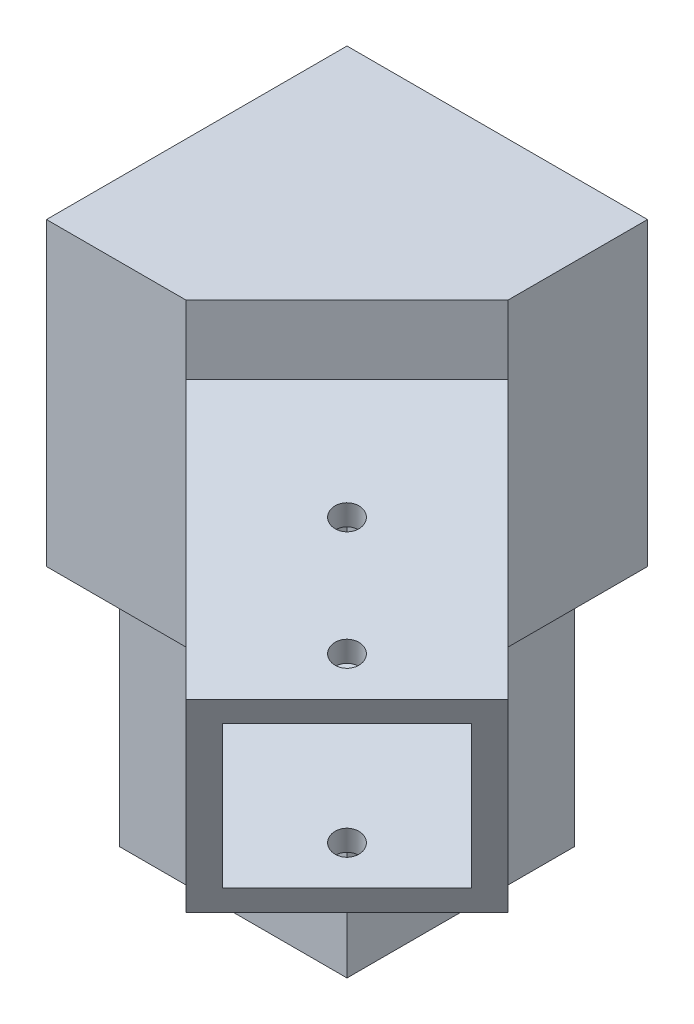
ISO-10303-21;
HEADER;
FILE_DESCRIPTION(('STEP AP214'),'2;1');
FILE_NAME('part.step','',(''),(''),'','','');
FILE_SCHEMA(('AUTOMOTIVE_DESIGN { 1 0 10303 214 1 1 1 1 }'));
ENDSEC;
DATA;
#1=APPLICATION_CONTEXT('core data for automotive mechanical design processes');
#2=APPLICATION_PROTOCOL_DEFINITION('international standard','automotive_design',2000,#1);
#3=PRODUCT_CONTEXT('',#1,'mechanical');
#4=PRODUCT('Part','Part','',(#3));
#5=PRODUCT_RELATED_PRODUCT_CATEGORY('part','',(#4));
#6=PRODUCT_DEFINITION_FORMATION('','',#4);
#7=PRODUCT_DEFINITION_CONTEXT('part definition',#1,'design');
#8=PRODUCT_DEFINITION('design','',#6,#7);
#9=PRODUCT_DEFINITION_SHAPE('','',#8);
#10=(LENGTH_UNIT() NAMED_UNIT(*) SI_UNIT(.MILLI.,.METRE.));
#11=(NAMED_UNIT(*) PLANE_ANGLE_UNIT() SI_UNIT($,.RADIAN.));
#12=(NAMED_UNIT(*) SI_UNIT($,.STERADIAN.) SOLID_ANGLE_UNIT());
#13=UNCERTAINTY_MEASURE_WITH_UNIT(LENGTH_MEASURE(1.E-05),#10,'distance_accuracy_value','');
#14=(GEOMETRIC_REPRESENTATION_CONTEXT(3) GLOBAL_UNCERTAINTY_ASSIGNED_CONTEXT((#13)) GLOBAL_UNIT_ASSIGNED_CONTEXT((#10,
#11,#12)) REPRESENTATION_CONTEXT('',''));
#15=CARTESIAN_POINT('',(0.,0.,0.));
#16=DIRECTION('',(0.,0.,1.));
#17=DIRECTION('',(1.,0.,0.));
#18=AXIS2_PLACEMENT_3D('',#15,#16,#17);
#19=CARTESIAN_POINT('',(-10.25,-50.,10.25));
#20=DIRECTION('',(0.,0.,1.));
#21=DIRECTION('',(1.,0.,0.));
#22=AXIS2_PLACEMENT_3D('',#19,#20,#21);
#23=PLANE('',#22);
#24=DIRECTION('',(0.,1.,0.));
#25=VECTOR('',#24,1.);
#26=CARTESIAN_POINT('',(-4.2456890143242,-50.,10.25));
#27=LINE('',#26,#25);
#28=CARTESIAN_POINT('',(-4.24568901432425,-11.5315924193513,10.25));
#29=VERTEX_POINT('',#28);
#30=CARTESIAN_POINT('',(-4.24568901432422,0.,10.25));
#31=VERTEX_POINT('',#30);
#32=EDGE_CURVE('E224',#29,#31,#27,.T.);
#33=ORIENTED_EDGE('',*,*,#32,.F.);
#34=DIRECTION('',(-0.986393923832144,0.164398987305357,0.));
#35=VECTOR('',#34,1.);
#36=CARTESIAN_POINT('',(-3.84960117649816,-11.597607058989,10.25));
#37=LINE('',#36,#35);
#38=CARTESIAN_POINT('',(10.25,-13.9475405884053,10.25));
#39=VERTEX_POINT('',#38);
#40=EDGE_CURVE('E232',#39,#29,#37,.T.);
#41=ORIENTED_EDGE('',*,*,#40,.F.);
#42=DIRECTION('',(0.,1.,0.));
#43=VECTOR('',#42,1.);
#44=CARTESIAN_POINT('',(10.25,-50.,10.25));
#45=LINE('',#44,#43);
#46=CARTESIAN_POINT('',(10.25,-50.,10.25));
#47=VERTEX_POINT('',#46);
#48=EDGE_CURVE('E345',#47,#39,#45,.T.);
#49=ORIENTED_EDGE('',*,*,#48,.F.);
#50=DIRECTION('',(1.,0.,0.));
#51=VECTOR('',#50,1.);
#52=CARTESIAN_POINT('',(-10.25,-50.,10.25));
#53=LINE('',#52,#51);
#54=CARTESIAN_POINT('',(-10.25,-50.,10.25));
#55=VERTEX_POINT('',#54);
#56=EDGE_CURVE('E341',#55,#47,#53,.T.);
#57=ORIENTED_EDGE('',*,*,#56,.F.);
#58=DIRECTION('',(0.,1.,0.));
#59=VECTOR('',#58,1.);
#60=CARTESIAN_POINT('',(-10.25,-50.,10.25));
#61=LINE('',#60,#59);
#62=CARTESIAN_POINT('',(-10.25,0.,10.25));
#63=VERTEX_POINT('',#62);
#64=EDGE_CURVE('E349',#55,#63,#61,.T.);
#65=ORIENTED_EDGE('',*,*,#64,.T.);
#66=DIRECTION('',(1.,0.,0.));
#67=VECTOR('',#66,1.);
#68=CARTESIAN_POINT('',(0.,0.,10.25));
#69=LINE('',#68,#67);
#70=EDGE_CURVE('E246',#63,#31,#69,.T.);
#71=ORIENTED_EDGE('',*,*,#70,.T.);
#72=EDGE_LOOP('',(#33,#41,#49,#57,#65,#71));
#73=FACE_BOUND('',#72,.T.);
#74=ADVANCED_FACE('F43',(#73),#23,.F.);
#75=CARTESIAN_POINT('',(13.25,-50.,-13.25));
#76=DIRECTION('',(1.,0.,0.));
#77=DIRECTION('',(0.,0.,-1.));
#78=AXIS2_PLACEMENT_3D('',#75,#76,#77);
#79=PLANE('',#78);
#80=CARTESIAN_POINT('',(13.25,-42.5,0.));
#81=DIRECTION('',(1.,0.,0.));
#82=DIRECTION('',(0.,0.,-1.));
#83=AXIS2_PLACEMENT_3D('',#80,#81,#82);
#84=CIRCLE('',#83,1.6);
#85=CARTESIAN_POINT('',(13.25,-42.5,-1.6));
#86=VERTEX_POINT('',#85);
#87=EDGE_CURVE('E560',#86,#86,#84,.T.);
#88=ORIENTED_EDGE('',*,*,#87,.F.);
#89=EDGE_LOOP('',(#88));
#90=FACE_BOUND('',#89,.T.);
#91=CARTESIAN_POINT('',(13.25,-22.5,0.));
#92=DIRECTION('',(1.,0.,0.));
#93=DIRECTION('',(0.,0.,-1.));
#94=AXIS2_PLACEMENT_3D('',#91,#92,#93);
#95=CIRCLE('',#94,1.6);
#96=CARTESIAN_POINT('',(13.25,-22.5,-1.6));
#97=VERTEX_POINT('',#96);
#98=EDGE_CURVE('E557',#97,#97,#95,.T.);
#99=ORIENTED_EDGE('',*,*,#98,.F.);
#100=EDGE_LOOP('',(#99));
#101=FACE_BOUND('',#100,.T.);
#102=DIRECTION('',(0.,1.,0.));
#103=VECTOR('',#102,1.);
#104=CARTESIAN_POINT('',(13.25,-50.,-13.25));
#105=LINE('',#104,#103);
#106=CARTESIAN_POINT('',(13.25,-50.,-13.25));
#107=VERTEX_POINT('',#106);
#108=CARTESIAN_POINT('',(13.25,-17.5,-13.25));
#109=VERTEX_POINT('',#108);
#110=EDGE_CURVE('E365',#107,#109,#105,.T.);
#111=ORIENTED_EDGE('',*,*,#110,.T.);
#112=DIRECTION('',(0.,0.,1.));
#113=VECTOR('',#112,1.);
#114=CARTESIAN_POINT('',(13.25,-17.5,-13.25));
#115=LINE('',#114,#113);
#116=CARTESIAN_POINT('',(13.25,-17.5,10.0715144606611));
#117=VERTEX_POINT('',#116);
#118=EDGE_CURVE('E294',#109,#117,#115,.T.);
#119=ORIENTED_EDGE('',*,*,#118,.T.);
#120=DIRECTION('',(0.,-0.164398987305357,0.986393923832144));
#121=VECTOR('',#120,1.);
#122=CARTESIAN_POINT('',(13.25,-14.5965111685415,-7.34941852809024));
#123=LINE('',#122,#121);
#124=CARTESIAN_POINT('',(13.25,-18.0297475898898,13.25));
#125=VERTEX_POINT('',#124);
#126=EDGE_CURVE('E330',#117,#125,#123,.T.);
#127=ORIENTED_EDGE('',*,*,#126,.T.);
#128=DIRECTION('',(0.,1.,0.));
#129=VECTOR('',#128,1.);
#130=CARTESIAN_POINT('',(13.25,-50.,13.25));
#131=LINE('',#130,#129);
#132=CARTESIAN_POINT('',(13.25,-50.,13.25));
#133=VERTEX_POINT('',#132);
#134=EDGE_CURVE('E366',#133,#125,#131,.T.);
#135=ORIENTED_EDGE('',*,*,#134,.F.);
#136=DIRECTION('',(0.,0.,-1.));
#137=VECTOR('',#136,1.);
#138=CARTESIAN_POINT('',(13.25,-50.,-13.25));
#139=LINE('',#138,#137);
#140=EDGE_CURVE('E348',#133,#107,#139,.T.);
#141=ORIENTED_EDGE('',*,*,#140,.T.);
#142=EDGE_LOOP('',(#111,#119,#127,#135,#141));
#143=FACE_BOUND('',#142,.T.);
#144=ADVANCED_FACE('F45',(#90,#101,#143),#79,.T.);
#145=CARTESIAN_POINT('',(-13.25,-50.,13.25));
#146=DIRECTION('',(0.,0.,1.));
#147=DIRECTION('',(1.,0.,0.));
#148=AXIS2_PLACEMENT_3D('',#145,#146,#147);
#149=PLANE('',#148);
#150=DIRECTION('',(-0.986393923832144,0.164398987305357,0.));
#151=VECTOR('',#150,1.);
#152=CARTESIAN_POINT('',(-7.34941852809024,-14.5965111685414,13.25));
#153=LINE('',#152,#151);
#154=CARTESIAN_POINT('',(10.0715144606611,-17.5,13.25));
#155=VERTEX_POINT('',#154);
#156=EDGE_CURVE('E328',#125,#155,#153,.T.);
#157=ORIENTED_EDGE('',*,*,#156,.T.);
#158=DIRECTION('',(-1.,0.,0.));
#159=VECTOR('',#158,1.);
#160=CARTESIAN_POINT('',(-13.25,-17.5,13.25));
#161=LINE('',#160,#159);
#162=CARTESIAN_POINT('',(-13.25,-17.5,13.25));
#163=VERTEX_POINT('',#162);
#164=EDGE_CURVE('E68',#155,#163,#161,.T.);
#165=ORIENTED_EDGE('',*,*,#164,.T.);
#166=DIRECTION('',(0.,1.,0.));
#167=VECTOR('',#166,1.);
#168=CARTESIAN_POINT('',(-13.25,-50.,13.25));
#169=LINE('',#168,#167);
#170=CARTESIAN_POINT('',(-13.25,-50.,13.25));
#171=VERTEX_POINT('',#170);
#172=EDGE_CURVE('E370',#171,#163,#169,.T.);
#173=ORIENTED_EDGE('',*,*,#172,.F.);
#174=DIRECTION('',(1.,0.,0.));
#175=VECTOR('',#174,1.);
#176=CARTESIAN_POINT('',(-13.25,-50.,13.25));
#177=LINE('',#176,#175);
#178=EDGE_CURVE('E362',#171,#133,#177,.T.);
#179=ORIENTED_EDGE('',*,*,#178,.T.);
#180=ORIENTED_EDGE('',*,*,#134,.T.);
#181=EDGE_LOOP('',(#157,#165,#173,#179,#180));
#182=FACE_BOUND('',#181,.T.);
#183=ADVANCED_FACE('F463',(#182),#149,.T.);
#184=CARTESIAN_POINT('',(10.25,-50.,-10.25));
#185=DIRECTION('',(1.,0.,0.));
#186=DIRECTION('',(0.,0.,-1.));
#187=AXIS2_PLACEMENT_3D('',#184,#185,#186);
#188=PLANE('',#187);
#189=CARTESIAN_POINT('',(10.25,-42.5,0.));
#190=DIRECTION('',(1.,0.,0.));
#191=DIRECTION('',(0.,0.,-1.));
#192=AXIS2_PLACEMENT_3D('',#189,#190,#191);
#193=CIRCLE('',#192,1.6);
#194=CARTESIAN_POINT('',(10.25,-42.5,-1.6));
#195=VERTEX_POINT('',#194);
#196=EDGE_CURVE('E400',#195,#195,#193,.T.);
#197=ORIENTED_EDGE('',*,*,#196,.T.);
#198=EDGE_LOOP('',(#197));
#199=FACE_BOUND('',#198,.T.);
#200=CARTESIAN_POINT('',(10.25,-22.5,0.));
#201=DIRECTION('',(1.,0.,0.));
#202=DIRECTION('',(0.,0.,-1.));
#203=AXIS2_PLACEMENT_3D('',#200,#201,#202);
#204=CIRCLE('',#203,1.6);
#205=CARTESIAN_POINT('',(10.25,-22.5,-1.6));
#206=VERTEX_POINT('',#205);
#207=EDGE_CURVE('E545',#206,#206,#204,.T.);
#208=ORIENTED_EDGE('',*,*,#207,.T.);
#209=EDGE_LOOP('',(#208));
#210=FACE_BOUND('',#209,.T.);
#211=DIRECTION('',(0.,-0.164398987305357,0.986393923832144));
#212=VECTOR('',#211,1.);
#213=CARTESIAN_POINT('',(10.25,-11.597607058989,-3.84960117649816));
#214=LINE('',#213,#212);
#215=CARTESIAN_POINT('',(10.25,-11.5315924193513,-4.24568901432423));
#216=VERTEX_POINT('',#215);
#217=EDGE_CURVE('E235',#216,#39,#214,.T.);
#218=ORIENTED_EDGE('',*,*,#217,.F.);
#219=DIRECTION('',(0.,1.,0.));
#220=VECTOR('',#219,1.);
#221=CARTESIAN_POINT('',(10.25,-50.,-4.24568901432423));
#222=LINE('',#221,#220);
#223=CARTESIAN_POINT('',(10.25,0.,-4.24568901432423));
#224=VERTEX_POINT('',#223);
#225=EDGE_CURVE('E229',#216,#224,#222,.T.);
#226=ORIENTED_EDGE('',*,*,#225,.T.);
#227=DIRECTION('',(0.,0.,1.));
#228=VECTOR('',#227,1.);
#229=CARTESIAN_POINT('',(10.25,0.,0.));
#230=LINE('',#229,#228);
#231=CARTESIAN_POINT('',(10.25,0.,-10.25));
#232=VERTEX_POINT('',#231);
#233=EDGE_CURVE('E237',#232,#224,#230,.T.);
#234=ORIENTED_EDGE('',*,*,#233,.F.);
#235=DIRECTION('',(0.,1.,0.));
#236=VECTOR('',#235,1.);
#237=CARTESIAN_POINT('',(10.25,-50.,-10.25));
#238=LINE('',#237,#236);
#239=CARTESIAN_POINT('',(10.25,-50.,-10.25));
#240=VERTEX_POINT('',#239);
#241=EDGE_CURVE('E344',#240,#232,#238,.T.);
#242=ORIENTED_EDGE('',*,*,#241,.F.);
#243=DIRECTION('',(0.,0.,-1.));
#244=VECTOR('',#243,1.);
#245=CARTESIAN_POINT('',(10.25,-50.,-10.25));
#246=LINE('',#245,#244);
#247=EDGE_CURVE('E332',#47,#240,#246,.T.);
#248=ORIENTED_EDGE('',*,*,#247,.F.);
#249=ORIENTED_EDGE('',*,*,#48,.T.);
#250=EDGE_LOOP('',(#218,#226,#234,#242,#248,#249));
#251=FACE_BOUND('',#250,.T.);
#252=ADVANCED_FACE('F430',(#199,#210,#251),#188,.F.);
#253=CARTESIAN_POINT('',(-10.25,-50.,-10.25));
#254=DIRECTION('',(-1.,0.,0.));
#255=DIRECTION('',(0.,0.,1.));
#256=AXIS2_PLACEMENT_3D('',#253,#254,#255);
#257=PLANE('',#256);
#258=CARTESIAN_POINT('',(-10.25,-42.5,0.));
#259=DIRECTION('',(-1.,0.,0.));
#260=DIRECTION('',(0.,0.,1.));
#261=AXIS2_PLACEMENT_3D('',#258,#259,#260);
#262=CIRCLE('',#261,1.6);
#263=CARTESIAN_POINT('',(-10.25,-42.5,1.6));
#264=VERTEX_POINT('',#263);
#265=EDGE_CURVE('E544',#264,#264,#262,.T.);
#266=ORIENTED_EDGE('',*,*,#265,.T.);
#267=EDGE_LOOP('',(#266));
#268=FACE_BOUND('',#267,.T.);
#269=CARTESIAN_POINT('',(-10.25,-22.5,0.));
#270=DIRECTION('',(-1.,0.,0.));
#271=DIRECTION('',(0.,0.,1.));
#272=AXIS2_PLACEMENT_3D('',#269,#270,#271);
#273=CIRCLE('',#272,1.6);
#274=CARTESIAN_POINT('',(-10.25,-22.5,1.6));
#275=VERTEX_POINT('',#274);
#276=EDGE_CURVE('E549',#275,#275,#273,.T.);
#277=ORIENTED_EDGE('',*,*,#276,.T.);
#278=EDGE_LOOP('',(#277));
#279=FACE_BOUND('',#278,.T.);
#280=DIRECTION('',(0.,1.,0.));
#281=VECTOR('',#280,1.);
#282=CARTESIAN_POINT('',(-10.25,-50.,-10.25));
#283=LINE('',#282,#281);
#284=CARTESIAN_POINT('',(-10.25,-50.,-10.25));
#285=VERTEX_POINT('',#284);
#286=CARTESIAN_POINT('',(-10.25,0.,-10.25));
#287=VERTEX_POINT('',#286);
#288=EDGE_CURVE('E351',#285,#287,#283,.T.);
#289=ORIENTED_EDGE('',*,*,#288,.T.);
#290=DIRECTION('',(0.,0.,1.));
#291=VECTOR('',#290,1.);
#292=CARTESIAN_POINT('',(-10.25,0.,0.));
#293=LINE('',#292,#291);
#294=EDGE_CURVE('E243',#287,#63,#293,.T.);
#295=ORIENTED_EDGE('',*,*,#294,.T.);
#296=ORIENTED_EDGE('',*,*,#64,.F.);
#297=DIRECTION('',(0.,0.,1.));
#298=VECTOR('',#297,1.);
#299=CARTESIAN_POINT('',(-10.25,-50.,-10.25));
#300=LINE('',#299,#298);
#301=EDGE_CURVE('E338',#285,#55,#300,.T.);
#302=ORIENTED_EDGE('',*,*,#301,.F.);
#303=EDGE_LOOP('',(#289,#295,#296,#302));
#304=FACE_BOUND('',#303,.T.);
#305=ADVANCED_FACE('F439',(#268,#279,#304),#257,.F.);
#306=CARTESIAN_POINT('',(-10.25,-50.,-10.25));
#307=DIRECTION('',(0.,0.,-1.));
#308=DIRECTION('',(-1.,0.,0.));
#309=AXIS2_PLACEMENT_3D('',#306,#307,#308);
#310=PLANE('',#309);
#311=ORIENTED_EDGE('',*,*,#241,.T.);
#312=DIRECTION('',(1.,0.,0.));
#313=VECTOR('',#312,1.);
#314=CARTESIAN_POINT('',(0.,0.,-10.25));
#315=LINE('',#314,#313);
#316=EDGE_CURVE('E240',#287,#232,#315,.T.);
#317=ORIENTED_EDGE('',*,*,#316,.F.);
#318=ORIENTED_EDGE('',*,*,#288,.F.);
#319=DIRECTION('',(-1.,0.,0.));
#320=VECTOR('',#319,1.);
#321=CARTESIAN_POINT('',(-10.25,-50.,-10.25));
#322=LINE('',#321,#320);
#323=EDGE_CURVE('E335',#240,#285,#322,.T.);
#324=ORIENTED_EDGE('',*,*,#323,.F.);
#325=EDGE_LOOP('',(#311,#317,#318,#324));
#326=FACE_BOUND('',#325,.T.);
#327=ADVANCED_FACE('F442',(#326),#310,.F.);
#328=CARTESIAN_POINT('',(27.1926290598451,1.42581628636753,45.9309587612886));
#329=DIRECTION('',(0.707106781186548,0.,-0.707106781186547));
#330=DIRECTION('',(-0.707106781186547,0.,-0.707106781186548));
#331=AXIS2_PLACEMENT_3D('',#328,#329,#330);
#332=PLANE('',#331);
#333=DIRECTION('',(0.,-1.,0.));
#334=VECTOR('',#333,1.);
#335=CARTESIAN_POINT('',(3.01167029855649,17.5,21.75));
#336=LINE('',#335,#334);
#337=CARTESIAN_POINT('',(3.01167029855649,9.48613587346374,21.75));
#338=VERTEX_POINT('',#337);
#339=CARTESIAN_POINT('',(3.01167029855651,-17.5,21.75));
#340=VERTEX_POINT('',#339);
#341=EDGE_CURVE('E277',#338,#340,#336,.T.);
#342=ORIENTED_EDGE('',*,*,#341,.T.);
#343=DIRECTION('',(0.707106781186547,0.,0.707106781186548));
#344=VECTOR('',#343,1.);
#345=CARTESIAN_POINT('',(27.1926290598451,-17.5,45.9309587612886));
#346=LINE('',#345,#344);
#347=CARTESIAN_POINT('',(2.29159237960877,-17.5,21.0299220810523));
#348=VERTEX_POINT('',#347);
#349=EDGE_CURVE('E287',#348,#340,#346,.T.);
#350=ORIENTED_EDGE('',*,*,#349,.F.);
#351=DIRECTION('',(-0.688247201611685,0.229415733870562,-0.688247201611685));
#352=VECTOR('',#351,1.);
#353=CARTESIAN_POINT('',(22.8937613998799,-24.3673896734237,41.6320911013234));
#354=LINE('',#353,#352);
#355=CARTESIAN_POINT('',(22.8937613998799,-24.3673896734237,41.6320911013234));
#356=VERTEX_POINT('',#355);
#357=EDGE_CURVE('E320',#356,#348,#354,.T.);
#358=ORIENTED_EDGE('',*,*,#357,.F.);
#359=DIRECTION('',(-0.162221421130763,-0.973328526784575,-0.162221421130763));
#360=VECTOR('',#359,1.);
#361=CARTESIAN_POINT('',(27.1926290598451,1.42581628636753,45.9309587612886));
#362=LINE('',#361,#360);
#363=CARTESIAN_POINT('',(27.1926290598451,1.42581628636753,45.9309587612886));
#364=VERTEX_POINT('',#363);
#365=EDGE_CURVE('E313',#364,#356,#362,.T.);
#366=ORIENTED_EDGE('',*,*,#365,.F.);
#367=DIRECTION('',(-0.688247201611685,0.229415733870562,-0.688247201611685));
#368=VECTOR('',#367,1.);
#369=CARTESIAN_POINT('',(27.1926290598451,1.42581628636753,45.9309587612886));
#370=LINE('',#369,#368);
#371=EDGE_CURVE('E323',#364,#338,#370,.T.);
#372=ORIENTED_EDGE('',*,*,#371,.T.);
#373=EDGE_LOOP('',(#342,#350,#358,#366,#372));
#374=FACE_BOUND('',#373,.T.);
#375=ADVANCED_FACE('F444',(#374),#332,.F.);
#376=CARTESIAN_POINT('',(45.9309587612886,1.42581628636753,27.1926290598451));
#377=DIRECTION('',(-0.707106781186548,0.,0.707106781186547));
#378=DIRECTION('',(0.707106781186547,0.,0.707106781186548));
#379=AXIS2_PLACEMENT_3D('',#376,#377,#378);
#380=PLANE('',#379);
#381=DIRECTION('',(0.,-1.,0.));
#382=VECTOR('',#381,1.);
#383=CARTESIAN_POINT('',(21.75,17.5,3.0116702985565));
#384=LINE('',#383,#382);
#385=CARTESIAN_POINT('',(21.75,9.48613587346374,3.0116702985565));
#386=VERTEX_POINT('',#385);
#387=CARTESIAN_POINT('',(21.75,-17.5,3.01167029855649));
#388=VERTEX_POINT('',#387);
#389=EDGE_CURVE('E273',#386,#388,#384,.T.);
#390=ORIENTED_EDGE('',*,*,#389,.F.);
#391=DIRECTION('',(-0.688247201611685,0.229415733870562,-0.688247201611685));
#392=VECTOR('',#391,1.);
#393=CARTESIAN_POINT('',(45.9309587612886,1.42581628636753,27.1926290598451));
#394=LINE('',#393,#392);
#395=CARTESIAN_POINT('',(45.9309587612886,1.42581628636753,27.1926290598451));
#396=VERTEX_POINT('',#395);
#397=EDGE_CURVE('E326',#396,#386,#394,.T.);
#398=ORIENTED_EDGE('',*,*,#397,.F.);
#399=DIRECTION('',(0.162221421130763,0.973328526784575,0.162221421130763));
#400=VECTOR('',#399,1.);
#401=CARTESIAN_POINT('',(45.9309587612886,1.42581628636753,27.1926290598451));
#402=LINE('',#401,#400);
#403=CARTESIAN_POINT('',(41.6320911013234,-24.3673896734237,22.8937613998799));
#404=VERTEX_POINT('',#403);
#405=EDGE_CURVE('E212',#404,#396,#402,.T.);
#406=ORIENTED_EDGE('',*,*,#405,.F.);
#407=DIRECTION('',(-0.688247201611685,0.229415733870562,-0.688247201611685));
#408=VECTOR('',#407,1.);
#409=CARTESIAN_POINT('',(41.6320911013234,-24.3673896734237,22.8937613998799));
#410=LINE('',#409,#408);
#411=CARTESIAN_POINT('',(21.0299220810523,-17.5,2.29159237960878));
#412=VERTEX_POINT('',#411);
#413=EDGE_CURVE('E317',#404,#412,#410,.T.);
#414=ORIENTED_EDGE('',*,*,#413,.T.);
#415=DIRECTION('',(-0.707106781186547,0.,-0.707106781186548));
#416=VECTOR('',#415,1.);
#417=CARTESIAN_POINT('',(45.9309587612886,-17.5,27.1926290598451));
#418=LINE('',#417,#416);
#419=EDGE_CURVE('E291',#388,#412,#418,.T.);
#420=ORIENTED_EDGE('',*,*,#419,.F.);
#421=EDGE_LOOP('',(#390,#398,#406,#414,#420));
#422=FACE_BOUND('',#421,.T.);
#423=ADVANCED_FACE('F451',(#422),#380,.F.);
#424=CARTESIAN_POINT('',(22.8937613998799,-24.3673896734237,41.6320911013234));
#425=DIRECTION('',(0.162221421130763,0.973328526784575,0.162221421130763));
#426=DIRECTION('',(0.,-0.164398987305357,0.986393923832144));
#427=AXIS2_PLACEMENT_3D('',#424,#425,#426);
#428=PLANE('',#427);
#429=CARTESIAN_POINT('',(28.8216902425432,-23.2203110040709,28.8216902425432));
#430=DIRECTION('',(0.162221421130763,0.973328526784575,0.162221421130763));
#431=DIRECTION('',(0.,-0.164398987305357,0.986393923832144));
#432=AXIS2_PLACEMENT_3D('',#429,#430,#431);
#433=CIRCLE('',#432,1.59999999999999);
#434=CARTESIAN_POINT('',(28.8216902425432,-23.4833493837595,30.3999205206747));
#435=VERTEX_POINT('',#434);
#436=EDGE_CURVE('E382',#435,#435,#433,.F.);
#437=ORIENTED_EDGE('',*,*,#436,.F.);
#438=EDGE_LOOP('',(#437));
#439=FACE_BOUND('',#438,.T.);
#440=CARTESIAN_POINT('',(18.497982218368,-19.7790749960125,18.497982218368));
#441=DIRECTION('',(0.162221421130763,0.973328526784575,0.162221421130763));
#442=DIRECTION('',(0.,-0.164398987305357,0.986393923832144));
#443=AXIS2_PLACEMENT_3D('',#440,#441,#442);
#444=CIRCLE('',#443,1.6);
#445=CARTESIAN_POINT('',(18.497982218368,-20.0421133757011,20.0762124964994));
#446=VERTEX_POINT('',#445);
#447=EDGE_CURVE('E397',#446,#446,#444,.F.);
#448=ORIENTED_EDGE('',*,*,#447,.F.);
#449=EDGE_LOOP('',(#448));
#450=FACE_BOUND('',#449,.T.);
#451=DIRECTION('',(-0.707106781186548,0.,0.707106781186547));
#452=VECTOR('',#451,1.);
#453=CARTESIAN_POINT('',(2.29159237960877,-17.5,21.0299220810523));
#454=LINE('',#453,#452);
#455=EDGE_CURVE('E377',#412,#117,#454,.T.);
#456=ORIENTED_EDGE('',*,*,#455,.F.);
#457=ORIENTED_EDGE('',*,*,#413,.F.);
#458=DIRECTION('',(0.707106781186548,0.,-0.707106781186547));
#459=VECTOR('',#458,1.);
#460=CARTESIAN_POINT('',(22.8937613998799,-24.3673896734237,41.6320911013234));
#461=LINE('',#460,#459);
#462=EDGE_CURVE('E315',#356,#404,#461,.T.);
#463=ORIENTED_EDGE('',*,*,#462,.F.);
#464=ORIENTED_EDGE('',*,*,#357,.T.);
#465=EDGE_CURVE('E369',#155,#348,#454,.T.);
#466=ORIENTED_EDGE('',*,*,#465,.F.);
#467=ORIENTED_EDGE('',*,*,#156,.F.);
#468=ORIENTED_EDGE('',*,*,#126,.F.);
#469=EDGE_LOOP('',(#456,#457,#463,#464,#466,#467,#468));
#470=FACE_BOUND('',#469,.T.);
#471=ADVANCED_FACE('F468',(#439,#450,#470),#428,.F.);
#472=CARTESIAN_POINT('',(27.1926290598451,1.42581628636753,45.9309587612886));
#473=DIRECTION('',(-0.162221421130763,-0.973328526784575,-0.162221421130763));
#474=DIRECTION('',(0.,0.164398987305357,-0.986393923832144));
#475=AXIS2_PLACEMENT_3D('',#472,#473,#474);
#476=PLANE('',#475);
#477=CARTESIAN_POINT('',(33.1205579025084,2.57289495572034,33.1205579025085));
#478=DIRECTION('',(0.162221421130763,0.973328526784575,0.162221421130763));
#479=DIRECTION('',(0.,-0.164398987305357,0.986393923832144));
#480=AXIS2_PLACEMENT_3D('',#477,#478,#479);
#481=CIRCLE('',#480,1.59999999999999);
#482=CARTESIAN_POINT('',(33.1205579025084,2.30985657603177,34.6987881806399));
#483=VERTEX_POINT('',#482);
#484=EDGE_CURVE('E388',#483,#483,#481,.T.);
#485=ORIENTED_EDGE('',*,*,#484,.F.);
#486=EDGE_LOOP('',(#485));
#487=FACE_BOUND('',#486,.T.);
#488=CARTESIAN_POINT('',(22.7968498783332,6.01413096377877,22.7968498783332));
#489=DIRECTION('',(0.162221421130763,0.973328526784575,0.162221421130763));
#490=DIRECTION('',(0.,-0.164398987305357,0.986393923832144));
#491=AXIS2_PLACEMENT_3D('',#488,#489,#490);
#492=CIRCLE('',#491,1.6);
#493=CARTESIAN_POINT('',(22.7968498783332,5.7510925840902,24.3750801564646));
#494=VERTEX_POINT('',#493);
#495=EDGE_CURVE('E393',#494,#494,#492,.T.);
#496=ORIENTED_EDGE('',*,*,#495,.F.);
#497=EDGE_LOOP('',(#496));
#498=FACE_BOUND('',#497,.T.);
#499=DIRECTION('',(0.707106781186548,0.,-0.707106781186547));
#500=VECTOR('',#499,1.);
#501=CARTESIAN_POINT('',(3.0116702985565,9.48613587346374,21.75));
#502=LINE('',#501,#500);
#503=EDGE_CURVE('E284',#338,#386,#502,.T.);
#504=ORIENTED_EDGE('',*,*,#503,.F.);
#505=ORIENTED_EDGE('',*,*,#371,.F.);
#506=DIRECTION('',(-0.707106781186548,0.,0.707106781186548));
#507=VECTOR('',#506,1.);
#508=CARTESIAN_POINT('',(27.1926290598451,1.42581628636753,45.9309587612886));
#509=LINE('',#508,#507);
#510=EDGE_CURVE('E311',#396,#364,#509,.T.);
#511=ORIENTED_EDGE('',*,*,#510,.F.);
#512=ORIENTED_EDGE('',*,*,#397,.T.);
#513=EDGE_LOOP('',(#504,#505,#511,#512));
#514=FACE_BOUND('',#513,.T.);
#515=ADVANCED_FACE('F470',(#487,#498,#514),#476,.F.);
#516=CARTESIAN_POINT('',(43.3229741543367,-1.4941692939862,28.8272851400125));
#517=DIRECTION('',(-0.707106781186548,0.,0.707106781186547));
#518=DIRECTION('',(0.707106781186547,0.,0.707106781186548));
#519=AXIS2_PLACEMENT_3D('',#516,#517,#518);
#520=PLANE('',#519);
#521=DIRECTION('',(-0.688247201611685,0.229415733870562,-0.688247201611685));
#522=VECTOR('',#521,1.);
#523=CARTESIAN_POINT('',(43.3229741543367,-1.4941692939862,28.8272851400125));
#524=LINE('',#523,#522);
#525=CARTESIAN_POINT('',(43.3229741543367,-1.4941692939862,28.8272851400125));
#526=VERTEX_POINT('',#525);
#527=CARTESIAN_POINT('',(8.91061407375243,9.9766173995419,-5.58507494057179));
#528=VERTEX_POINT('',#527);
#529=EDGE_CURVE('E202',#526,#528,#524,.T.);
#530=ORIENTED_EDGE('',*,*,#529,.T.);
#531=DIRECTION('',(-0.162221421130763,-0.973328526784575,-0.162221421130763));
#532=VECTOR('',#531,1.);
#533=CARTESIAN_POINT('',(7.24784450716211,0.,-7.24784450716211));
#534=LINE('',#533,#532);
#535=CARTESIAN_POINT('',(7.24784450716211,0.,-7.24784450716211));
#536=VERTEX_POINT('',#535);
#537=EDGE_CURVE('E205',#528,#536,#534,.T.);
#538=ORIENTED_EDGE('',*,*,#537,.T.);
#539=DIRECTION('',(-0.707106781186547,0.,-0.707106781186548));
#540=VECTOR('',#539,1.);
#541=CARTESIAN_POINT('',(7.24784450716211,0.,-7.24784450716211));
#542=LINE('',#541,#540);
#543=EDGE_CURVE('E11',#224,#536,#542,.T.);
#544=ORIENTED_EDGE('',*,*,#543,.F.);
#545=ORIENTED_EDGE('',*,*,#225,.F.);
#546=DIRECTION('',(-0.688247201611685,0.229415733870562,-0.688247201611685));
#547=VECTOR('',#546,1.);
#548=CARTESIAN_POINT('',(39.9974350211561,-21.44740409307,25.5017460068318));
#549=LINE('',#548,#547);
#550=CARTESIAN_POINT('',(39.9974350211561,-21.44740409307,25.5017460068318));
#551=VERTEX_POINT('',#550);
#552=EDGE_CURVE('E304',#551,#216,#549,.T.);
#553=ORIENTED_EDGE('',*,*,#552,.F.);
#554=DIRECTION('',(0.162221421130763,0.973328526784575,0.162221421130763));
#555=VECTOR('',#554,1.);
#556=CARTESIAN_POINT('',(43.3229741543367,-1.4941692939862,28.8272851400125));
#557=LINE('',#556,#555);
#558=EDGE_CURVE('E208',#551,#526,#557,.T.);
#559=ORIENTED_EDGE('',*,*,#558,.T.);
#560=EDGE_LOOP('',(#530,#538,#544,#545,#553,#559));
#561=FACE_BOUND('',#560,.T.);
#562=ADVANCED_FACE('F204',(#561),#520,.T.);
#563=CARTESIAN_POINT('',(28.8272851400125,-1.49416929398619,43.3229741543367));
#564=DIRECTION('',(-0.162221421130763,-0.973328526784575,-0.162221421130763));
#565=DIRECTION('',(0.986393923832144,-0.164398987305357,0.));
#566=AXIS2_PLACEMENT_3D('',#563,#564,#565);
#567=PLANE('',#566);
#568=CARTESIAN_POINT('',(32.6338936391162,-0.347090624633381,32.6338936391162));
#569=DIRECTION('',(-0.162221421130763,-0.973328526784575,-0.162221421130763));
#570=DIRECTION('',(0.986393923832144,-0.164398987305357,0.));
#571=AXIS2_PLACEMENT_3D('',#568,#569,#570);
#572=CIRCLE('',#571,1.59999999999999);
#573=CARTESIAN_POINT('',(34.2121239172476,-0.610129004321951,32.6338936391162));
#574=VERTEX_POINT('',#573);
#575=EDGE_CURVE('E219',#574,#574,#572,.T.);
#576=ORIENTED_EDGE('',*,*,#575,.F.);
#577=EDGE_LOOP('',(#576));
#578=FACE_BOUND('',#577,.T.);
#579=CARTESIAN_POINT('',(22.3101856149409,3.09414538342504,22.3101856149409));
#580=DIRECTION('',(-0.162221421130763,-0.973328526784575,-0.162221421130763));
#581=DIRECTION('',(0.986393923832144,-0.164398987305357,0.));
#582=AXIS2_PLACEMENT_3D('',#579,#580,#581);
#583=CIRCLE('',#582,1.6);
#584=CARTESIAN_POINT('',(23.8884158930723,2.83110700373647,22.3101856149409));
#585=VERTEX_POINT('',#584);
#586=EDGE_CURVE('E381',#585,#585,#583,.T.);
#587=ORIENTED_EDGE('',*,*,#586,.F.);
#588=EDGE_LOOP('',(#587));
#589=FACE_BOUND('',#588,.T.);
#590=DIRECTION('',(-0.688247201611685,0.229415733870562,-0.688247201611685));
#591=VECTOR('',#590,1.);
#592=CARTESIAN_POINT('',(28.8272851400125,-1.49416929398619,43.3229741543367));
#593=LINE('',#592,#591);
#594=CARTESIAN_POINT('',(28.8272851400125,-1.49416929398619,43.3229741543367));
#595=VERTEX_POINT('',#594);
#596=CARTESIAN_POINT('',(-5.5850749405718,9.9766173995419,8.91061407375243));
#597=VERTEX_POINT('',#596);
#598=EDGE_CURVE('E213',#595,#597,#593,.T.);
#599=ORIENTED_EDGE('',*,*,#598,.T.);
#600=DIRECTION('',(0.707106781186548,0.,-0.707106781186547));
#601=VECTOR('',#600,1.);
#602=CARTESIAN_POINT('',(1.66276956659032,9.9766173995419,1.66276956659032));
#603=LINE('',#602,#601);
#604=EDGE_CURVE('E216',#597,#528,#603,.T.);
#605=ORIENTED_EDGE('',*,*,#604,.T.);
#606=ORIENTED_EDGE('',*,*,#529,.F.);
#607=DIRECTION('',(-0.707106781186548,0.,0.707106781186547));
#608=VECTOR('',#607,1.);
#609=CARTESIAN_POINT('',(28.8272851400125,-1.49416929398619,43.3229741543367));
#610=LINE('',#609,#608);
#611=EDGE_CURVE('E297',#526,#595,#610,.T.);
#612=ORIENTED_EDGE('',*,*,#611,.T.);
#613=EDGE_LOOP('',(#599,#605,#606,#612));
#614=FACE_BOUND('',#613,.T.);
#615=ADVANCED_FACE('F221',(#578,#589,#614),#567,.T.);
#616=CARTESIAN_POINT('',(28.8272851400125,-1.49416929398619,43.3229741543367));
#617=DIRECTION('',(0.707106781186548,0.,-0.707106781186547));
#618=DIRECTION('',(-0.707106781186547,0.,-0.707106781186548));
#619=AXIS2_PLACEMENT_3D('',#616,#617,#618);
#620=PLANE('',#619);
#621=DIRECTION('',(-0.688247201611685,0.229415733870562,-0.688247201611685));
#622=VECTOR('',#621,1.);
#623=CARTESIAN_POINT('',(25.5017460068318,-21.44740409307,39.9974350211561));
#624=LINE('',#623,#622);
#625=CARTESIAN_POINT('',(25.5017460068318,-21.44740409307,39.9974350211561));
#626=VERTEX_POINT('',#625);
#627=EDGE_CURVE('E306',#626,#29,#624,.T.);
#628=ORIENTED_EDGE('',*,*,#627,.T.);
#629=ORIENTED_EDGE('',*,*,#32,.T.);
#630=DIRECTION('',(-0.707106781186547,0.,-0.707106781186548));
#631=VECTOR('',#630,1.);
#632=CARTESIAN_POINT('',(-7.24784450716211,0.,7.24784450716211));
#633=LINE('',#632,#631);
#634=CARTESIAN_POINT('',(-7.24784450716211,0.,7.24784450716211));
#635=VERTEX_POINT('',#634);
#636=EDGE_CURVE('E52',#31,#635,#633,.T.);
#637=ORIENTED_EDGE('',*,*,#636,.T.);
#638=DIRECTION('',(-0.162221421130763,-0.973328526784575,-0.162221421130763));
#639=VECTOR('',#638,1.);
#640=CARTESIAN_POINT('',(-7.24784450716211,0.,7.24784450716211));
#641=LINE('',#640,#639);
#642=EDGE_CURVE('E60',#597,#635,#641,.T.);
#643=ORIENTED_EDGE('',*,*,#642,.F.);
#644=ORIENTED_EDGE('',*,*,#598,.F.);
#645=DIRECTION('',(-0.162221421130762,-0.973328526784575,-0.162221421130763));
#646=VECTOR('',#645,1.);
#647=CARTESIAN_POINT('',(28.8272851400125,-1.49416929398619,43.3229741543367));
#648=LINE('',#647,#646);
#649=EDGE_CURVE('E299',#595,#626,#648,.T.);
#650=ORIENTED_EDGE('',*,*,#649,.T.);
#651=EDGE_LOOP('',(#628,#629,#637,#643,#644,#650));
#652=FACE_BOUND('',#651,.T.);
#653=ADVANCED_FACE('F414',(#652),#620,.T.);
#654=CARTESIAN_POINT('',(25.5017460068318,-21.44740409307,39.9974350211561));
#655=DIRECTION('',(0.162221421130763,0.973328526784575,0.162221421130763));
#656=DIRECTION('',(0.,-0.164398987305357,0.986393923832144));
#657=AXIS2_PLACEMENT_3D('',#654,#655,#656);
#658=PLANE('',#657);
#659=CARTESIAN_POINT('',(29.3083545059355,-20.3003254237172,29.3083545059355));
#660=DIRECTION('',(0.162221421130763,0.973328526784575,0.162221421130763));
#661=DIRECTION('',(0.,-0.164398987305357,0.986393923832144));
#662=AXIS2_PLACEMENT_3D('',#659,#660,#661);
#663=CIRCLE('',#662,1.59999999999999);
#664=CARTESIAN_POINT('',(29.3083545059355,-20.5633638034057,30.886584784067));
#665=VERTEX_POINT('',#664);
#666=EDGE_CURVE('E47',#665,#665,#663,.T.);
#667=ORIENTED_EDGE('',*,*,#666,.F.);
#668=EDGE_LOOP('',(#667));
#669=FACE_BOUND('',#668,.T.);
#670=CARTESIAN_POINT('',(18.9846464817603,-16.8590894156588,18.9846464817603));
#671=DIRECTION('',(0.162221421130763,0.973328526784575,0.162221421130763));
#672=DIRECTION('',(0.,-0.164398987305357,0.986393923832144));
#673=AXIS2_PLACEMENT_3D('',#670,#671,#672);
#674=CIRCLE('',#673,1.6);
#675=CARTESIAN_POINT('',(18.9846464817603,-17.1221277953473,20.5628767598917));
#676=VERTEX_POINT('',#675);
#677=EDGE_CURVE('E379',#676,#676,#674,.T.);
#678=ORIENTED_EDGE('',*,*,#677,.F.);
#679=EDGE_LOOP('',(#678));
#680=FACE_BOUND('',#679,.T.);
#681=ORIENTED_EDGE('',*,*,#40,.T.);
#682=ORIENTED_EDGE('',*,*,#627,.F.);
#683=DIRECTION('',(0.707106781186548,0.,-0.707106781186547));
#684=VECTOR('',#683,1.);
#685=CARTESIAN_POINT('',(25.5017460068318,-21.44740409307,39.9974350211561));
#686=LINE('',#685,#684);
#687=EDGE_CURVE('E302',#626,#551,#686,.T.);
#688=ORIENTED_EDGE('',*,*,#687,.T.);
#689=ORIENTED_EDGE('',*,*,#552,.T.);
#690=ORIENTED_EDGE('',*,*,#217,.T.);
#691=EDGE_LOOP('',(#681,#682,#688,#689,#690));
#692=FACE_BOUND('',#691,.T.);
#693=ADVANCED_FACE('F410',(#669,#680,#692),#658,.T.);
#694=CARTESIAN_POINT('',(-13.25,-50.,-13.25));
#695=DIRECTION('',(-1.,0.,0.));
#696=DIRECTION('',(0.,0.,1.));
#697=AXIS2_PLACEMENT_3D('',#694,#695,#696);
#698=PLANE('',#697);
#699=CARTESIAN_POINT('',(-13.25,-42.5,0.));
#700=DIRECTION('',(1.,0.,0.));
#701=DIRECTION('',(0.,0.,-1.));
#702=AXIS2_PLACEMENT_3D('',#699,#700,#701);
#703=CIRCLE('',#702,1.6);
#704=CARTESIAN_POINT('',(-13.25,-42.5,-1.6));
#705=VERTEX_POINT('',#704);
#706=EDGE_CURVE('E541',#705,#705,#703,.T.);
#707=ORIENTED_EDGE('',*,*,#706,.T.);
#708=EDGE_LOOP('',(#707));
#709=FACE_BOUND('',#708,.T.);
#710=CARTESIAN_POINT('',(-13.25,-22.5,0.));
#711=DIRECTION('',(1.,0.,0.));
#712=DIRECTION('',(0.,0.,-1.));
#713=AXIS2_PLACEMENT_3D('',#710,#711,#712);
#714=CIRCLE('',#713,1.6);
#715=CARTESIAN_POINT('',(-13.25,-22.5,-1.6));
#716=VERTEX_POINT('',#715);
#717=EDGE_CURVE('E554',#716,#716,#714,.T.);
#718=ORIENTED_EDGE('',*,*,#717,.T.);
#719=EDGE_LOOP('',(#718));
#720=FACE_BOUND('',#719,.T.);
#721=DIRECTION('',(0.,0.,1.));
#722=VECTOR('',#721,1.);
#723=CARTESIAN_POINT('',(-13.25,17.5,-13.25));
#724=LINE('',#723,#722);
#725=CARTESIAN_POINT('',(-13.25,17.5,-13.25));
#726=VERTEX_POINT('',#725);
#727=CARTESIAN_POINT('',(-13.25,17.5,21.75));
#728=VERTEX_POINT('',#727);
#729=EDGE_CURVE('E253',#726,#728,#724,.T.);
#730=ORIENTED_EDGE('',*,*,#729,.F.);
#731=DIRECTION('',(0.,1.,0.));
#732=VECTOR('',#731,1.);
#733=CARTESIAN_POINT('',(-13.25,-50.,-13.25));
#734=LINE('',#733,#732);
#735=CARTESIAN_POINT('',(-13.25,-50.,-13.25));
#736=VERTEX_POINT('',#735);
#737=EDGE_CURVE('E372',#736,#726,#734,.T.);
#738=ORIENTED_EDGE('',*,*,#737,.F.);
#739=DIRECTION('',(0.,0.,1.));
#740=VECTOR('',#739,1.);
#741=CARTESIAN_POINT('',(-13.25,-50.,-13.25));
#742=LINE('',#741,#740);
#743=EDGE_CURVE('E359',#736,#171,#742,.T.);
#744=ORIENTED_EDGE('',*,*,#743,.T.);
#745=ORIENTED_EDGE('',*,*,#172,.T.);
#746=DIRECTION('',(0.,0.,1.));
#747=VECTOR('',#746,1.);
#748=CARTESIAN_POINT('',(-13.25,-17.5,-13.25));
#749=LINE('',#748,#747);
#750=CARTESIAN_POINT('',(-13.25,-17.5,21.75));
#751=VERTEX_POINT('',#750);
#752=EDGE_CURVE('E265',#163,#751,#749,.T.);
#753=ORIENTED_EDGE('',*,*,#752,.T.);
#754=DIRECTION('',(0.,-1.,0.));
#755=VECTOR('',#754,1.);
#756=CARTESIAN_POINT('',(-13.25,17.5,21.75));
#757=LINE('',#756,#755);
#758=EDGE_CURVE('E281',#728,#751,#757,.T.);
#759=ORIENTED_EDGE('',*,*,#758,.F.);
#760=EDGE_LOOP('',(#730,#738,#744,#745,#753,#759));
#761=FACE_BOUND('',#760,.T.);
#762=ADVANCED_FACE('F413',(#709,#720,#761),#698,.T.);
#763=CARTESIAN_POINT('',(-13.25,-50.,-13.25));
#764=DIRECTION('',(0.,0.,-1.));
#765=DIRECTION('',(-1.,0.,0.));
#766=AXIS2_PLACEMENT_3D('',#763,#764,#765);
#767=PLANE('',#766);
#768=DIRECTION('',(-1.,0.,0.));
#769=VECTOR('',#768,1.);
#770=CARTESIAN_POINT('',(21.75,-17.5,-13.25));
#771=LINE('',#770,#769);
#772=CARTESIAN_POINT('',(21.75,-17.5,-13.25));
#773=VERTEX_POINT('',#772);
#774=EDGE_CURVE('E249',#773,#109,#771,.T.);
#775=ORIENTED_EDGE('',*,*,#774,.T.);
#776=ORIENTED_EDGE('',*,*,#110,.F.);
#777=DIRECTION('',(-1.,0.,0.));
#778=VECTOR('',#777,1.);
#779=CARTESIAN_POINT('',(-13.25,-50.,-13.25));
#780=LINE('',#779,#778);
#781=EDGE_CURVE('E356',#107,#736,#780,.T.);
#782=ORIENTED_EDGE('',*,*,#781,.T.);
#783=ORIENTED_EDGE('',*,*,#737,.T.);
#784=DIRECTION('',(-1.,0.,0.));
#785=VECTOR('',#784,1.);
#786=CARTESIAN_POINT('',(21.75,17.5,-13.25));
#787=LINE('',#786,#785);
#788=CARTESIAN_POINT('',(21.75,17.5,-13.25));
#789=VERTEX_POINT('',#788);
#790=EDGE_CURVE('E250',#789,#726,#787,.T.);
#791=ORIENTED_EDGE('',*,*,#790,.F.);
#792=DIRECTION('',(0.,-1.,0.));
#793=VECTOR('',#792,1.);
#794=CARTESIAN_POINT('',(21.75,17.5,-13.25));
#795=LINE('',#794,#793);
#796=EDGE_CURVE('E262',#789,#773,#795,.T.);
#797=ORIENTED_EDGE('',*,*,#796,.T.);
#798=EDGE_LOOP('',(#775,#776,#782,#783,#791,#797));
#799=FACE_BOUND('',#798,.T.);
#800=ADVANCED_FACE('F565',(#799),#767,.T.);
#801=CARTESIAN_POINT('',(0.,-50.,0.));
#802=DIRECTION('',(0.,1.,0.));
#803=DIRECTION('',(0.,0.,1.));
#804=AXIS2_PLACEMENT_3D('',#801,#802,#803);
#805=PLANE('',#804);
#806=ORIENTED_EDGE('',*,*,#56,.T.);
#807=ORIENTED_EDGE('',*,*,#247,.T.);
#808=ORIENTED_EDGE('',*,*,#323,.T.);
#809=ORIENTED_EDGE('',*,*,#301,.T.);
#810=EDGE_LOOP('',(#806,#807,#808,#809));
#811=FACE_BOUND('',#810,.T.);
#812=ORIENTED_EDGE('',*,*,#140,.F.);
#813=ORIENTED_EDGE('',*,*,#178,.F.);
#814=ORIENTED_EDGE('',*,*,#743,.F.);
#815=ORIENTED_EDGE('',*,*,#781,.F.);
#816=EDGE_LOOP('',(#812,#813,#814,#815));
#817=FACE_BOUND('',#816,.T.);
#818=ADVANCED_FACE('F434',(#811,#817),#805,.F.);
#819=CARTESIAN_POINT('',(34.4123600805843,-11.4707866935281,34.4123600805843));
#820=DIRECTION('',(0.688247201611685,-0.229415733870562,0.688247201611686));
#821=DIRECTION('',(0.707106781186548,0.,-0.707106781186547));
#822=AXIS2_PLACEMENT_3D('',#819,#820,#821);
#823=PLANE('',#822);
#824=ORIENTED_EDGE('',*,*,#405,.T.);
#825=ORIENTED_EDGE('',*,*,#510,.T.);
#826=ORIENTED_EDGE('',*,*,#365,.T.);
#827=ORIENTED_EDGE('',*,*,#462,.T.);
#828=EDGE_LOOP('',(#824,#825,#826,#827));
#829=FACE_BOUND('',#828,.T.);
#830=ORIENTED_EDGE('',*,*,#611,.F.);
#831=ORIENTED_EDGE('',*,*,#558,.F.);
#832=ORIENTED_EDGE('',*,*,#687,.F.);
#833=ORIENTED_EDGE('',*,*,#649,.F.);
#834=EDGE_LOOP('',(#830,#831,#832,#833));
#835=FACE_BOUND('',#834,.T.);
#836=ADVANCED_FACE('F477',(#829,#835),#823,.T.);
#837=CARTESIAN_POINT('',(0.,-17.5,0.));
#838=DIRECTION('',(0.,1.,0.));
#839=DIRECTION('',(0.,0.,1.));
#840=AXIS2_PLACEMENT_3D('',#837,#838,#839);
#841=PLANE('',#840);
#842=ORIENTED_EDGE('',*,*,#164,.F.);
#843=ORIENTED_EDGE('',*,*,#465,.T.);
#844=ORIENTED_EDGE('',*,*,#349,.T.);
#845=DIRECTION('',(1.,0.,0.));
#846=VECTOR('',#845,1.);
#847=CARTESIAN_POINT('',(-13.25,-17.5,21.75));
#848=LINE('',#847,#846);
#849=EDGE_CURVE('E267',#751,#340,#848,.T.);
#850=ORIENTED_EDGE('',*,*,#849,.F.);
#851=ORIENTED_EDGE('',*,*,#752,.F.);
#852=EDGE_LOOP('',(#842,#843,#844,#850,#851));
#853=FACE_BOUND('',#852,.T.);
#854=ADVANCED_FACE('F480',(#853),#841,.F.);
#855=CARTESIAN_POINT('',(0.,17.5,0.));
#856=DIRECTION('',(0.,1.,0.));
#857=DIRECTION('',(0.,0.,1.));
#858=AXIS2_PLACEMENT_3D('',#855,#856,#857);
#859=PLANE('',#858);
#860=ORIENTED_EDGE('',*,*,#790,.T.);
#861=ORIENTED_EDGE('',*,*,#729,.T.);
#862=DIRECTION('',(1.,0.,0.));
#863=VECTOR('',#862,1.);
#864=CARTESIAN_POINT('',(-13.25,17.5,21.75));
#865=LINE('',#864,#863);
#866=CARTESIAN_POINT('',(3.01167029855649,17.5,21.75));
#867=VERTEX_POINT('',#866);
#868=EDGE_CURVE('E256',#728,#867,#865,.T.);
#869=ORIENTED_EDGE('',*,*,#868,.T.);
#870=DIRECTION('',(0.707106781186548,0.,-0.707106781186547));
#871=VECTOR('',#870,1.);
#872=CARTESIAN_POINT('',(3.01167029855649,17.5,21.75));
#873=LINE('',#872,#871);
#874=CARTESIAN_POINT('',(21.75,17.5,3.0116702985565));
#875=VERTEX_POINT('',#874);
#876=EDGE_CURVE('E258',#867,#875,#873,.T.);
#877=ORIENTED_EDGE('',*,*,#876,.T.);
#878=DIRECTION('',(0.,0.,-1.));
#879=VECTOR('',#878,1.);
#880=CARTESIAN_POINT('',(21.75,17.5,3.0116702985565));
#881=LINE('',#880,#879);
#882=EDGE_CURVE('E260',#875,#789,#881,.T.);
#883=ORIENTED_EDGE('',*,*,#882,.T.);
#884=EDGE_LOOP('',(#860,#861,#869,#877,#883));
#885=FACE_BOUND('',#884,.T.);
#886=ADVANCED_FACE('F500',(#885),#859,.T.);
#887=CARTESIAN_POINT('',(21.75,17.5,3.0116702985565));
#888=DIRECTION('',(-1.,0.,0.));
#889=DIRECTION('',(0.,0.,1.));
#890=AXIS2_PLACEMENT_3D('',#887,#888,#889);
#891=PLANE('',#890);
#892=DIRECTION('',(0.,0.,-1.));
#893=VECTOR('',#892,1.);
#894=CARTESIAN_POINT('',(21.75,-17.5,3.0116702985565));
#895=LINE('',#894,#893);
#896=EDGE_CURVE('E254',#388,#773,#895,.T.);
#897=ORIENTED_EDGE('',*,*,#896,.T.);
#898=ORIENTED_EDGE('',*,*,#796,.F.);
#899=ORIENTED_EDGE('',*,*,#882,.F.);
#900=EDGE_CURVE('E274',#875,#386,#384,.T.);
#901=ORIENTED_EDGE('',*,*,#900,.T.);
#902=ORIENTED_EDGE('',*,*,#389,.T.);
#903=EDGE_LOOP('',(#897,#898,#899,#901,#902));
#904=FACE_BOUND('',#903,.T.);
#905=ADVANCED_FACE('F492',(#904),#891,.F.);
#906=CARTESIAN_POINT('',(-13.25,17.5,21.75));
#907=DIRECTION('',(0.,0.,-1.));
#908=DIRECTION('',(-1.,0.,0.));
#909=AXIS2_PLACEMENT_3D('',#906,#907,#908);
#910=PLANE('',#909);
#911=ORIENTED_EDGE('',*,*,#849,.T.);
#912=ORIENTED_EDGE('',*,*,#341,.F.);
#913=EDGE_CURVE('E278',#867,#338,#336,.T.);
#914=ORIENTED_EDGE('',*,*,#913,.F.);
#915=ORIENTED_EDGE('',*,*,#868,.F.);
#916=ORIENTED_EDGE('',*,*,#758,.T.);
#917=EDGE_LOOP('',(#911,#912,#914,#915,#916));
#918=FACE_BOUND('',#917,.T.);
#919=ADVANCED_FACE('F488',(#918),#910,.F.);
#920=CARTESIAN_POINT('',(3.01167029855649,17.5,21.75));
#921=DIRECTION('',(-0.707106781186547,0.,-0.707106781186548));
#922=DIRECTION('',(-0.707106781186548,0.,0.707106781186547));
#923=AXIS2_PLACEMENT_3D('',#920,#921,#922);
#924=PLANE('',#923);
#925=ORIENTED_EDGE('',*,*,#913,.T.);
#926=ORIENTED_EDGE('',*,*,#503,.T.);
#927=ORIENTED_EDGE('',*,*,#900,.F.);
#928=ORIENTED_EDGE('',*,*,#876,.F.);
#929=EDGE_LOOP('',(#925,#926,#927,#928));
#930=FACE_BOUND('',#929,.T.);
#931=ADVANCED_FACE('F491',(#930),#924,.F.);
#932=ORIENTED_EDGE('',*,*,#118,.F.);
#933=ORIENTED_EDGE('',*,*,#774,.F.);
#934=ORIENTED_EDGE('',*,*,#896,.F.);
#935=ORIENTED_EDGE('',*,*,#419,.T.);
#936=ORIENTED_EDGE('',*,*,#455,.T.);
#937=EDGE_LOOP('',(#932,#933,#934,#935,#936));
#938=FACE_BOUND('',#937,.T.);
#939=ADVANCED_FACE('F496',(#938),#841,.F.);
#940=CARTESIAN_POINT('',(0.,0.,0.));
#941=DIRECTION('',(0.,1.,0.));
#942=DIRECTION('',(0.,0.,1.));
#943=AXIS2_PLACEMENT_3D('',#940,#941,#942);
#944=PLANE('',#943);
#945=ORIENTED_EDGE('',*,*,#233,.T.);
#946=ORIENTED_EDGE('',*,*,#543,.T.);
#947=DIRECTION('',(0.707106781186548,0.,-0.707106781186547));
#948=VECTOR('',#947,1.);
#949=CARTESIAN_POINT('',(0.,0.,0.));
#950=LINE('',#949,#948);
#951=EDGE_CURVE('E218',#635,#536,#950,.T.);
#952=ORIENTED_EDGE('',*,*,#951,.F.);
#953=ORIENTED_EDGE('',*,*,#636,.F.);
#954=ORIENTED_EDGE('',*,*,#70,.F.);
#955=ORIENTED_EDGE('',*,*,#294,.F.);
#956=ORIENTED_EDGE('',*,*,#316,.T.);
#957=EDGE_LOOP('',(#945,#946,#952,#953,#954,#955,#956));
#958=FACE_BOUND('',#957,.T.);
#959=ADVANCED_FACE('F425',(#958),#944,.F.);
#960=CARTESIAN_POINT('',(0.,0.,0.));
#961=DIRECTION('',(0.688247201611685,-0.229415733870562,0.688247201611685));
#962=DIRECTION('',(0.707106781186548,0.,-0.707106781186547));
#963=AXIS2_PLACEMENT_3D('',#960,#961,#962);
#964=PLANE('',#963);
#965=ORIENTED_EDGE('',*,*,#951,.T.);
#966=ORIENTED_EDGE('',*,*,#537,.F.);
#967=ORIENTED_EDGE('',*,*,#604,.F.);
#968=ORIENTED_EDGE('',*,*,#642,.T.);
#969=EDGE_LOOP('',(#965,#966,#967,#968));
#970=FACE_BOUND('',#969,.T.);
#971=ADVANCED_FACE('F215',(#970),#964,.T.);
#972=CARTESIAN_POINT('',(17.7638518699822,-24.1838570863273,17.7638518699822));
#973=DIRECTION('',(0.162221421130763,0.973328526784575,0.162221421130763));
#974=DIRECTION('',(0.,-0.164398987305357,0.986393923832144));
#975=AXIS2_PLACEMENT_3D('',#972,#973,#974);
#976=CYLINDRICAL_SURFACE('',#975,1.6);
#977=ORIENTED_EDGE('',*,*,#677,.T.);
#978=EDGE_LOOP('',(#977));
#979=FACE_BOUND('',#978,.T.);
#980=ORIENTED_EDGE('',*,*,#447,.T.);
#981=EDGE_LOOP('',(#980));
#982=FACE_BOUND('',#981,.T.);
#983=ADVANCED_FACE('F512',(#979,#982),#976,.F.);
#984=CARTESIAN_POINT('',(28.0875598941574,-27.6250930943857,28.0875598941574));
#985=DIRECTION('',(0.162221421130763,0.973328526784575,0.162221421130763));
#986=DIRECTION('',(0.,-0.164398987305357,0.986393923832144));
#987=AXIS2_PLACEMENT_3D('',#984,#985,#986);
#988=CYLINDRICAL_SURFACE('',#987,1.59999999999999);
#989=ORIENTED_EDGE('',*,*,#666,.T.);
#990=EDGE_LOOP('',(#989));
#991=FACE_BOUND('',#990,.T.);
#992=ORIENTED_EDGE('',*,*,#436,.T.);
#993=EDGE_LOOP('',(#992));
#994=FACE_BOUND('',#993,.T.);
#995=ADVANCED_FACE('F408',(#991,#994),#988,.F.);
#996=ORIENTED_EDGE('',*,*,#586,.T.);
#997=EDGE_LOOP('',(#996));
#998=FACE_BOUND('',#997,.T.);
#999=ORIENTED_EDGE('',*,*,#495,.T.);
#1000=EDGE_LOOP('',(#999));
#1001=FACE_BOUND('',#1000,.T.);
#1002=ADVANCED_FACE('F515',(#998,#1001),#976,.F.);
#1003=ORIENTED_EDGE('',*,*,#575,.T.);
#1004=EDGE_LOOP('',(#1003));
#1005=FACE_BOUND('',#1004,.T.);
#1006=ORIENTED_EDGE('',*,*,#484,.T.);
#1007=EDGE_LOOP('',(#1006));
#1008=FACE_BOUND('',#1007,.T.);
#1009=ADVANCED_FACE('F518',(#1005,#1008),#988,.F.);
#1010=CARTESIAN_POINT('',(-13.25,-22.5,0.));
#1011=DIRECTION('',(1.,0.,0.));
#1012=DIRECTION('',(0.,0.,-1.));
#1013=AXIS2_PLACEMENT_3D('',#1010,#1011,#1012);
#1014=CYLINDRICAL_SURFACE('',#1013,1.6);
#1015=ORIENTED_EDGE('',*,*,#717,.F.);
#1016=EDGE_LOOP('',(#1015));
#1017=FACE_BOUND('',#1016,.T.);
#1018=ORIENTED_EDGE('',*,*,#276,.F.);
#1019=EDGE_LOOP('',(#1018));
#1020=FACE_BOUND('',#1019,.T.);
#1021=ADVANCED_FACE('F525',(#1017,#1020),#1014,.F.);
#1022=CARTESIAN_POINT('',(-13.25,-42.5,0.));
#1023=DIRECTION('',(1.,0.,0.));
#1024=DIRECTION('',(0.,0.,-1.));
#1025=AXIS2_PLACEMENT_3D('',#1022,#1023,#1024);
#1026=CYLINDRICAL_SURFACE('',#1025,1.6);
#1027=ORIENTED_EDGE('',*,*,#706,.F.);
#1028=EDGE_LOOP('',(#1027));
#1029=FACE_BOUND('',#1028,.T.);
#1030=ORIENTED_EDGE('',*,*,#265,.F.);
#1031=EDGE_LOOP('',(#1030));
#1032=FACE_BOUND('',#1031,.T.);
#1033=ADVANCED_FACE('F523',(#1029,#1032),#1026,.F.);
#1034=ORIENTED_EDGE('',*,*,#98,.T.);
#1035=EDGE_LOOP('',(#1034));
#1036=FACE_BOUND('',#1035,.T.);
#1037=ORIENTED_EDGE('',*,*,#207,.F.);
#1038=EDGE_LOOP('',(#1037));
#1039=FACE_BOUND('',#1038,.T.);
#1040=ADVANCED_FACE('F519',(#1036,#1039),#1014,.F.);
#1041=ORIENTED_EDGE('',*,*,#87,.T.);
#1042=EDGE_LOOP('',(#1041));
#1043=FACE_BOUND('',#1042,.T.);
#1044=ORIENTED_EDGE('',*,*,#196,.F.);
#1045=EDGE_LOOP('',(#1044));
#1046=FACE_BOUND('',#1045,.T.);
#1047=ADVANCED_FACE('F522',(#1043,#1046),#1026,.F.);
#1048=CLOSED_SHELL('',(#74,#144,#183,#252,#305,#327,#375,#423,#471,#515,#562,#615,#653,#693,
#762,#800,#818,#836,#854,#886,#905,#919,#931,#939,#959,#971,#983,#995,#1002,#1009,#1021,#1033,
#1040,#1047));
#1049=MANIFOLD_SOLID_BREP('B2',#1048);
#1050=ADVANCED_BREP_SHAPE_REPRESENTATION('',(#18,#1049),#14);
#1051=SHAPE_DEFINITION_REPRESENTATION(#9,#1050);
ENDSEC;
END-ISO-10303-21;
